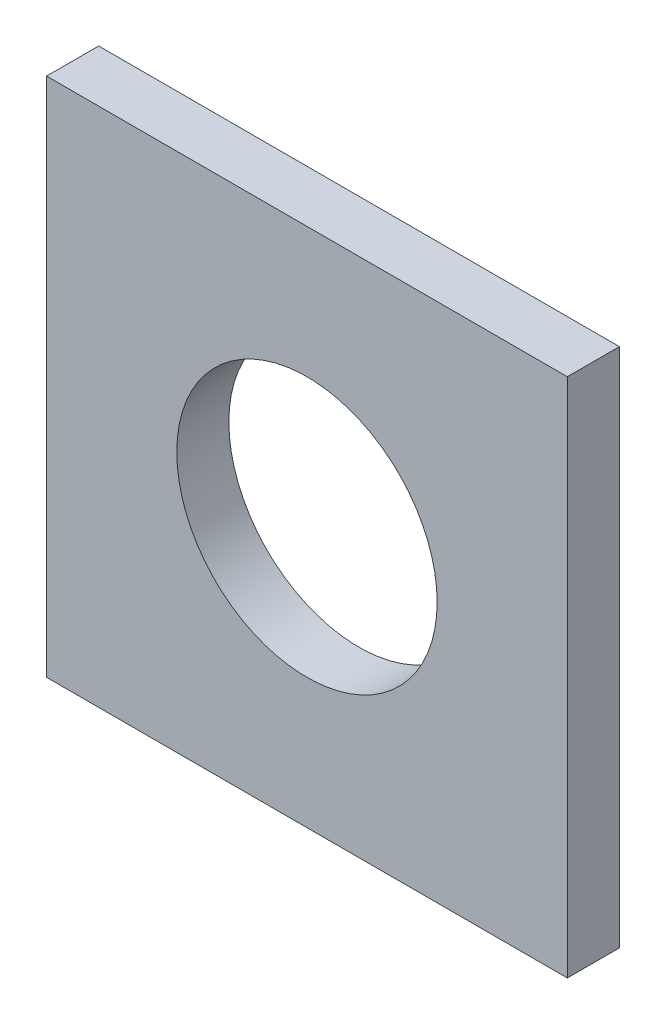
ISO-10303-21;
HEADER;
FILE_DESCRIPTION(('STEP AP214'),'2;1');
FILE_NAME('part.step','',(''),(''),'','','');
FILE_SCHEMA(('AUTOMOTIVE_DESIGN { 1 0 10303 214 1 1 1 1 }'));
ENDSEC;
DATA;
#1=APPLICATION_CONTEXT('core data for automotive mechanical design processes');
#2=APPLICATION_PROTOCOL_DEFINITION('international standard','automotive_design',2000,#1);
#3=PRODUCT_CONTEXT('',#1,'mechanical');
#4=PRODUCT('Part','Part','',(#3));
#5=PRODUCT_RELATED_PRODUCT_CATEGORY('part','',(#4));
#6=PRODUCT_DEFINITION_FORMATION('','',#4);
#7=PRODUCT_DEFINITION_CONTEXT('part definition',#1,'design');
#8=PRODUCT_DEFINITION('design','',#6,#7);
#9=PRODUCT_DEFINITION_SHAPE('','',#8);
#10=(LENGTH_UNIT() NAMED_UNIT(*) SI_UNIT(.MILLI.,.METRE.));
#11=(NAMED_UNIT(*) PLANE_ANGLE_UNIT() SI_UNIT($,.RADIAN.));
#12=(NAMED_UNIT(*) SI_UNIT($,.STERADIAN.) SOLID_ANGLE_UNIT());
#13=UNCERTAINTY_MEASURE_WITH_UNIT(LENGTH_MEASURE(1.E-05),#10,'distance_accuracy_value','');
#14=(GEOMETRIC_REPRESENTATION_CONTEXT(3) GLOBAL_UNCERTAINTY_ASSIGNED_CONTEXT((#13)) GLOBAL_UNIT_ASSIGNED_CONTEXT((#10,
#11,#12)) REPRESENTATION_CONTEXT('',''));
#15=CARTESIAN_POINT('',(0.,0.,0.));
#16=DIRECTION('',(0.,0.,1.));
#17=DIRECTION('',(1.,0.,0.));
#18=AXIS2_PLACEMENT_3D('',#15,#16,#17);
#19=CARTESIAN_POINT('',(50.,-50.,10.));
#20=DIRECTION('',(-1.,0.,0.));
#21=DIRECTION('',(0.,0.,1.));
#22=AXIS2_PLACEMENT_3D('',#19,#20,#21);
#23=PLANE('',#22);
#24=DIRECTION('',(0.,1.,0.));
#25=VECTOR('',#24,1.);
#26=CARTESIAN_POINT('',(50.,-50.,0.));
#27=LINE('',#26,#25);
#28=CARTESIAN_POINT('',(50.,-50.,0.));
#29=VERTEX_POINT('',#28);
#30=CARTESIAN_POINT('',(50.,50.,0.));
#31=VERTEX_POINT('',#30);
#32=EDGE_CURVE('E96',#29,#31,#27,.T.);
#33=ORIENTED_EDGE('',*,*,#32,.T.);
#34=DIRECTION('',(0.,0.,-1.));
#35=VECTOR('',#34,1.);
#36=CARTESIAN_POINT('',(50.,50.,10.));
#37=LINE('',#36,#35);
#38=CARTESIAN_POINT('',(50.,50.,10.));
#39=VERTEX_POINT('',#38);
#40=EDGE_CURVE('E11',#39,#31,#37,.T.);
#41=ORIENTED_EDGE('',*,*,#40,.F.);
#42=DIRECTION('',(0.,1.,0.));
#43=VECTOR('',#42,1.);
#44=CARTESIAN_POINT('',(50.,-50.,10.));
#45=LINE('',#44,#43);
#46=CARTESIAN_POINT('',(50.,-50.,10.));
#47=VERTEX_POINT('',#46);
#48=EDGE_CURVE('E84',#47,#39,#45,.T.);
#49=ORIENTED_EDGE('',*,*,#48,.F.);
#50=DIRECTION('',(0.,0.,-1.));
#51=VECTOR('',#50,1.);
#52=CARTESIAN_POINT('',(50.,-50.,10.));
#53=LINE('',#52,#51);
#54=EDGE_CURVE('E92',#47,#29,#53,.T.);
#55=ORIENTED_EDGE('',*,*,#54,.T.);
#56=EDGE_LOOP('',(#33,#41,#49,#55));
#57=FACE_BOUND('',#56,.T.);
#58=ADVANCED_FACE('F33',(#57),#23,.F.);
#59=CARTESIAN_POINT('',(-50.,50.,10.));
#60=DIRECTION('',(0.,-1.,0.));
#61=DIRECTION('',(0.,0.,-1.));
#62=AXIS2_PLACEMENT_3D('',#59,#60,#61);
#63=PLANE('',#62);
#64=DIRECTION('',(-1.,0.,0.));
#65=VECTOR('',#64,1.);
#66=CARTESIAN_POINT('',(-50.,50.,0.));
#67=LINE('',#66,#65);
#68=CARTESIAN_POINT('',(-50.,50.,0.));
#69=VERTEX_POINT('',#68);
#70=EDGE_CURVE('E88',#31,#69,#67,.T.);
#71=ORIENTED_EDGE('',*,*,#70,.T.);
#72=DIRECTION('',(0.,0.,-1.));
#73=VECTOR('',#72,1.);
#74=CARTESIAN_POINT('',(-50.,50.,10.));
#75=LINE('',#74,#73);
#76=CARTESIAN_POINT('',(-50.,50.,10.));
#77=VERTEX_POINT('',#76);
#78=EDGE_CURVE('E41',#77,#69,#75,.T.);
#79=ORIENTED_EDGE('',*,*,#78,.F.);
#80=DIRECTION('',(-1.,0.,0.));
#81=VECTOR('',#80,1.);
#82=CARTESIAN_POINT('',(-50.,50.,10.));
#83=LINE('',#82,#81);
#84=EDGE_CURVE('E79',#39,#77,#83,.T.);
#85=ORIENTED_EDGE('',*,*,#84,.F.);
#86=ORIENTED_EDGE('',*,*,#40,.T.);
#87=EDGE_LOOP('',(#71,#79,#85,#86));
#88=FACE_BOUND('',#87,.T.);
#89=ADVANCED_FACE('F87',(#88),#63,.F.);
#90=CARTESIAN_POINT('',(-50.,-50.,10.));
#91=DIRECTION('',(1.,0.,0.));
#92=DIRECTION('',(0.,0.,-1.));
#93=AXIS2_PLACEMENT_3D('',#90,#91,#92);
#94=PLANE('',#93);
#95=DIRECTION('',(0.,-1.,0.));
#96=VECTOR('',#95,1.);
#97=CARTESIAN_POINT('',(-50.,-50.,0.));
#98=LINE('',#97,#96);
#99=CARTESIAN_POINT('',(-50.,-50.,0.));
#100=VERTEX_POINT('',#99);
#101=EDGE_CURVE('E66',#69,#100,#98,.T.);
#102=ORIENTED_EDGE('',*,*,#101,.T.);
#103=DIRECTION('',(0.,0.,-1.));
#104=VECTOR('',#103,1.);
#105=CARTESIAN_POINT('',(-50.,-50.,10.));
#106=LINE('',#105,#104);
#107=CARTESIAN_POINT('',(-50.,-50.,10.));
#108=VERTEX_POINT('',#107);
#109=EDGE_CURVE('E89',#108,#100,#106,.T.);
#110=ORIENTED_EDGE('',*,*,#109,.F.);
#111=DIRECTION('',(0.,-1.,0.));
#112=VECTOR('',#111,1.);
#113=CARTESIAN_POINT('',(-50.,-50.,10.));
#114=LINE('',#113,#112);
#115=EDGE_CURVE('E82',#77,#108,#114,.T.);
#116=ORIENTED_EDGE('',*,*,#115,.F.);
#117=ORIENTED_EDGE('',*,*,#78,.T.);
#118=EDGE_LOOP('',(#102,#110,#116,#117));
#119=FACE_BOUND('',#118,.T.);
#120=ADVANCED_FACE('F90',(#119),#94,.F.);
#121=CARTESIAN_POINT('',(-50.,-50.,10.));
#122=DIRECTION('',(0.,1.,0.));
#123=DIRECTION('',(0.,0.,1.));
#124=AXIS2_PLACEMENT_3D('',#121,#122,#123);
#125=PLANE('',#124);
#126=DIRECTION('',(1.,0.,0.));
#127=VECTOR('',#126,1.);
#128=CARTESIAN_POINT('',(-50.,-50.,0.));
#129=LINE('',#128,#127);
#130=EDGE_CURVE('E72',#100,#29,#129,.T.);
#131=ORIENTED_EDGE('',*,*,#130,.T.);
#132=ORIENTED_EDGE('',*,*,#54,.F.);
#133=DIRECTION('',(1.,0.,0.));
#134=VECTOR('',#133,1.);
#135=CARTESIAN_POINT('',(-50.,-50.,10.));
#136=LINE('',#135,#134);
#137=EDGE_CURVE('E49',#108,#47,#136,.T.);
#138=ORIENTED_EDGE('',*,*,#137,.F.);
#139=ORIENTED_EDGE('',*,*,#109,.T.);
#140=EDGE_LOOP('',(#131,#132,#138,#139));
#141=FACE_BOUND('',#140,.T.);
#142=ADVANCED_FACE('F104',(#141),#125,.F.);
#143=CARTESIAN_POINT('',(0.,0.,10.));
#144=DIRECTION('',(0.,0.,-1.));
#145=DIRECTION('',(-1.,0.,0.));
#146=AXIS2_PLACEMENT_3D('',#143,#144,#145);
#147=PLANE('',#146);
#148=CARTESIAN_POINT('',(0.,0.,10.));
#149=DIRECTION('',(0.,0.,1.));
#150=DIRECTION('',(1.,0.,0.));
#151=AXIS2_PLACEMENT_3D('',#148,#149,#150);
#152=CIRCLE('',#151,25.);
#153=CARTESIAN_POINT('',(25.,0.,10.));
#154=VERTEX_POINT('',#153);
#155=EDGE_CURVE('E110',#154,#154,#152,.T.);
#156=ORIENTED_EDGE('',*,*,#155,.F.);
#157=EDGE_LOOP('',(#156));
#158=FACE_BOUND('',#157,.T.);
#159=ORIENTED_EDGE('',*,*,#48,.T.);
#160=ORIENTED_EDGE('',*,*,#84,.T.);
#161=ORIENTED_EDGE('',*,*,#115,.T.);
#162=ORIENTED_EDGE('',*,*,#137,.T.);
#163=EDGE_LOOP('',(#159,#160,#161,#162));
#164=FACE_BOUND('',#163,.T.);
#165=ADVANCED_FACE('F80',(#158,#164),#147,.F.);
#166=CARTESIAN_POINT('',(0.,0.,0.));
#167=DIRECTION('',(0.,0.,-1.));
#168=DIRECTION('',(-1.,0.,0.));
#169=AXIS2_PLACEMENT_3D('',#166,#167,#168);
#170=PLANE('',#169);
#171=CARTESIAN_POINT('',(0.,0.,0.));
#172=DIRECTION('',(0.,0.,1.));
#173=DIRECTION('',(1.,0.,0.));
#174=AXIS2_PLACEMENT_3D('',#171,#172,#173);
#175=CIRCLE('',#174,25.);
#176=CARTESIAN_POINT('',(25.,0.,0.));
#177=VERTEX_POINT('',#176);
#178=EDGE_CURVE('E99',#177,#177,#175,.T.);
#179=ORIENTED_EDGE('',*,*,#178,.T.);
#180=EDGE_LOOP('',(#179));
#181=FACE_BOUND('',#180,.T.);
#182=ORIENTED_EDGE('',*,*,#32,.F.);
#183=ORIENTED_EDGE('',*,*,#130,.F.);
#184=ORIENTED_EDGE('',*,*,#101,.F.);
#185=ORIENTED_EDGE('',*,*,#70,.F.);
#186=EDGE_LOOP('',(#182,#183,#184,#185));
#187=FACE_BOUND('',#186,.T.);
#188=ADVANCED_FACE('F107',(#181,#187),#170,.T.);
#189=CARTESIAN_POINT('',(0.,0.,0.));
#190=DIRECTION('',(0.,0.,1.));
#191=DIRECTION('',(1.,0.,0.));
#192=AXIS2_PLACEMENT_3D('',#189,#190,#191);
#193=CYLINDRICAL_SURFACE('',#192,25.);
#194=ORIENTED_EDGE('',*,*,#178,.F.);
#195=EDGE_LOOP('',(#194));
#196=FACE_BOUND('',#195,.T.);
#197=ORIENTED_EDGE('',*,*,#155,.T.);
#198=EDGE_LOOP('',(#197));
#199=FACE_BOUND('',#198,.T.);
#200=ADVANCED_FACE('F117',(#196,#199),#193,.F.);
#201=CLOSED_SHELL('',(#58,#89,#120,#142,#165,#188,#200));
#202=MANIFOLD_SOLID_BREP('B2',#201);
#203=ADVANCED_BREP_SHAPE_REPRESENTATION('',(#18,#202),#14);
#204=SHAPE_DEFINITION_REPRESENTATION(#9,#203);
ENDSEC;
END-ISO-10303-21;
